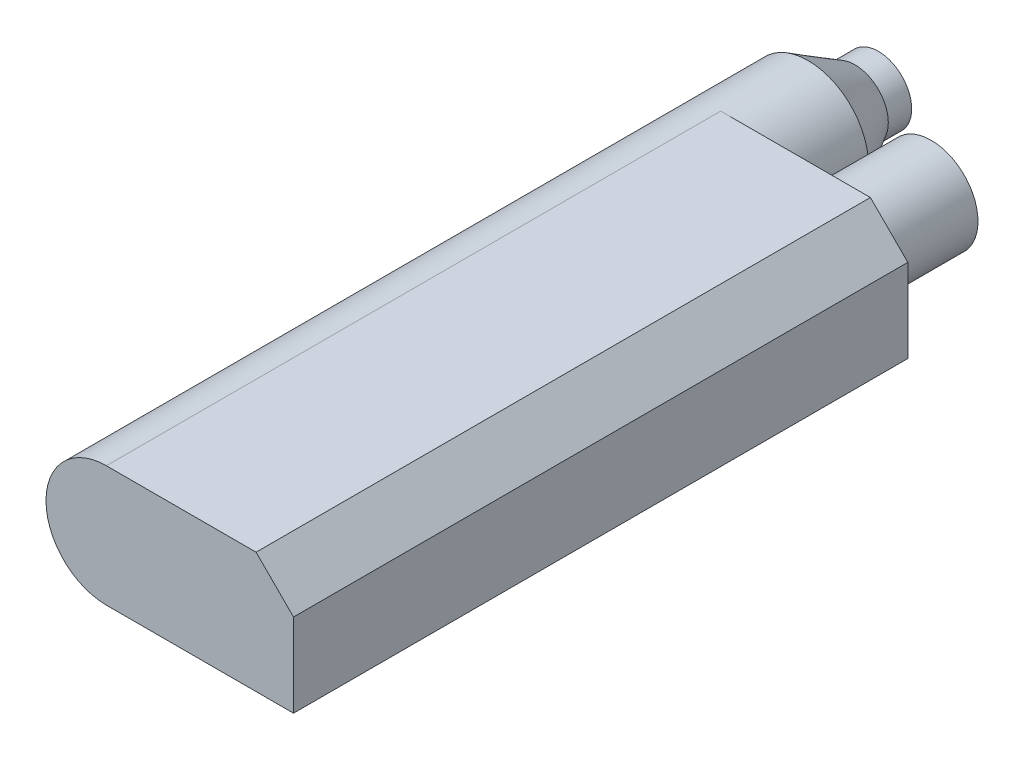
ISO-10303-21;
HEADER;
FILE_DESCRIPTION(('STEP AP214'),'2;1');
FILE_NAME('part.step','',(''),(''),'','','');
FILE_SCHEMA(('AUTOMOTIVE_DESIGN { 1 0 10303 214 1 1 1 1 }'));
ENDSEC;
DATA;
#1=APPLICATION_CONTEXT('core data for automotive mechanical design processes');
#2=APPLICATION_PROTOCOL_DEFINITION('international standard','automotive_design',2000,#1);
#3=PRODUCT_CONTEXT('',#1,'mechanical');
#4=PRODUCT('Part','Part','',(#3));
#5=PRODUCT_RELATED_PRODUCT_CATEGORY('part','',(#4));
#6=PRODUCT_DEFINITION_FORMATION('','',#4);
#7=PRODUCT_DEFINITION_CONTEXT('part definition',#1,'design');
#8=PRODUCT_DEFINITION('design','',#6,#7);
#9=PRODUCT_DEFINITION_SHAPE('','',#8);
#10=(LENGTH_UNIT() NAMED_UNIT(*) SI_UNIT(.MILLI.,.METRE.));
#11=(NAMED_UNIT(*) PLANE_ANGLE_UNIT() SI_UNIT($,.RADIAN.));
#12=(NAMED_UNIT(*) SI_UNIT($,.STERADIAN.) SOLID_ANGLE_UNIT());
#13=UNCERTAINTY_MEASURE_WITH_UNIT(LENGTH_MEASURE(1.E-05),#10,'distance_accuracy_value','');
#14=(GEOMETRIC_REPRESENTATION_CONTEXT(3) GLOBAL_UNCERTAINTY_ASSIGNED_CONTEXT((#13)) GLOBAL_UNIT_ASSIGNED_CONTEXT((#10,
#11,#12)) REPRESENTATION_CONTEXT('',''));
#15=CARTESIAN_POINT('',(0.,0.,0.));
#16=DIRECTION('',(0.,0.,1.));
#17=DIRECTION('',(1.,0.,0.));
#18=AXIS2_PLACEMENT_3D('',#15,#16,#17);
#19=CARTESIAN_POINT('',(0.,0.,500.));
#20=DIRECTION('',(0.,0.,-1.));
#21=DIRECTION('',(-1.,0.,0.));
#22=AXIS2_PLACEMENT_3D('',#19,#20,#21);
#23=CYLINDRICAL_SURFACE('',#22,713.105);
#24=CARTESIAN_POINT('',(0.,0.,500.));
#25=DIRECTION('',(0.,0.,1.));
#26=DIRECTION('',(1.,0.,0.));
#27=AXIS2_PLACEMENT_3D('',#24,#25,#26);
#28=CIRCLE('',#27,713.105);
#29=CARTESIAN_POINT('',(713.105,0.,500.));
#30=VERTEX_POINT('',#29);
#31=EDGE_CURVE('E129',#30,#30,#28,.T.);
#32=ORIENTED_EDGE('',*,*,#31,.F.);
#33=EDGE_LOOP('',(#32));
#34=FACE_BOUND('',#33,.T.);
#35=CARTESIAN_POINT('',(0.,0.,0.));
#36=DIRECTION('',(0.,0.,1.));
#37=DIRECTION('',(1.,0.,0.));
#38=AXIS2_PLACEMENT_3D('',#35,#36,#37);
#39=CIRCLE('',#38,713.105);
#40=CARTESIAN_POINT('',(713.105,0.,0.));
#41=VERTEX_POINT('',#40);
#42=EDGE_CURVE('E128',#41,#41,#39,.T.);
#43=ORIENTED_EDGE('',*,*,#42,.T.);
#44=EDGE_LOOP('',(#43));
#45=FACE_BOUND('',#44,.T.);
#46=ADVANCED_FACE('F41',(#34,#45),#23,.T.);
#47=CARTESIAN_POINT('',(0.,0.,0.));
#48=DIRECTION('',(0.,0.,1.));
#49=DIRECTION('',(1.,0.,0.));
#50=AXIS2_PLACEMENT_3D('',#47,#48,#49);
#51=PLANE('',#50);
#52=ORIENTED_EDGE('',*,*,#42,.F.);
#53=EDGE_LOOP('',(#52));
#54=FACE_BOUND('',#53,.T.);
#55=ADVANCED_FACE('F161',(#54),#51,.F.);
#56=CARTESIAN_POINT('',(0.,0.,500.));
#57=DIRECTION('',(0.,0.,1.));
#58=DIRECTION('',(1.,0.,0.));
#59=AXIS2_PLACEMENT_3D('',#56,#57,#58);
#60=CONICAL_SURFACE('',#59,713.105,0.5235987755983);
#61=CARTESIAN_POINT('',(0.,0.,1500.));
#62=DIRECTION('',(0.,0.,1.));
#63=DIRECTION('',(1.,0.,0.));
#64=AXIS2_PLACEMENT_3D('',#61,#62,#63);
#65=CIRCLE('',#64,1290.45526918963);
#66=CARTESIAN_POINT('',(1290.45526918963,0.,1500.));
#67=VERTEX_POINT('',#66);
#68=EDGE_CURVE('E125',#67,#67,#65,.T.);
#69=ORIENTED_EDGE('',*,*,#68,.F.);
#70=EDGE_LOOP('',(#69));
#71=FACE_BOUND('',#70,.T.);
#72=ORIENTED_EDGE('',*,*,#31,.T.);
#73=EDGE_LOOP('',(#72));
#74=FACE_BOUND('',#73,.T.);
#75=ADVANCED_FACE('F166',(#71,#74),#60,.T.);
#76=CARTESIAN_POINT('',(0.,0.,16500.));
#77=DIRECTION('',(0.,0.,-1.));
#78=DIRECTION('',(-1.,0.,0.));
#79=AXIS2_PLACEMENT_3D('',#76,#77,#78);
#80=CYLINDRICAL_SURFACE('',#79,1290.45526918963);
#81=CARTESIAN_POINT('',(0.,0.,16500.));
#82=DIRECTION('',(0.,0.,1.));
#83=DIRECTION('',(1.,0.,0.));
#84=AXIS2_PLACEMENT_3D('',#81,#82,#83);
#85=CIRCLE('',#84,1290.45526918963);
#86=CARTESIAN_POINT('',(0.,1290.45526918963,16500.));
#87=VERTEX_POINT('',#86);
#88=CARTESIAN_POINT('',(0.,-1290.45526918963,16500.));
#89=VERTEX_POINT('',#88);
#90=EDGE_CURVE('E101',#87,#89,#85,.T.);
#91=ORIENTED_EDGE('',*,*,#90,.F.);
#92=DIRECTION('',(0.,0.,1.));
#93=VECTOR('',#92,1.);
#94=CARTESIAN_POINT('',(0.,1290.45526918963,16500.));
#95=LINE('',#94,#93);
#96=CARTESIAN_POINT('',(0.,1290.45526918963,3369.71253889435));
#97=VERTEX_POINT('',#96);
#98=EDGE_CURVE('E116',#97,#87,#95,.T.);
#99=ORIENTED_EDGE('',*,*,#98,.F.);
#100=CARTESIAN_POINT('',(0.,0.,3369.71253889435));
#101=DIRECTION('',(0.,0.,1.));
#102=DIRECTION('',(1.,0.,0.));
#103=AXIS2_PLACEMENT_3D('',#100,#101,#102);
#104=CIRCLE('',#103,1290.45526918963);
#105=CARTESIAN_POINT('',(0.,-1290.45526918963,3369.71253889435));
#106=VERTEX_POINT('',#105);
#107=EDGE_CURVE('E132',#106,#97,#104,.T.);
#108=ORIENTED_EDGE('',*,*,#107,.F.);
#109=DIRECTION('',(0.,0.,-1.));
#110=VECTOR('',#109,1.);
#111=CARTESIAN_POINT('',(0.,-1290.45526918963,16500.));
#112=LINE('',#111,#110);
#113=EDGE_CURVE('E95',#89,#106,#112,.T.);
#114=ORIENTED_EDGE('',*,*,#113,.F.);
#115=EDGE_LOOP('',(#91,#99,#108,#114));
#116=FACE_BOUND('',#115,.T.);
#117=ORIENTED_EDGE('',*,*,#68,.T.);
#118=EDGE_LOOP('',(#117));
#119=FACE_BOUND('',#118,.T.);
#120=ADVANCED_FACE('F174',(#116,#119),#80,.T.);
#121=CARTESIAN_POINT('',(0.,0.,16500.));
#122=DIRECTION('',(0.,0.,1.));
#123=DIRECTION('',(1.,0.,0.));
#124=AXIS2_PLACEMENT_3D('',#121,#122,#123);
#125=PLANE('',#124);
#126=DIRECTION('',(0.,-1.,0.));
#127=VECTOR('',#126,1.);
#128=CARTESIAN_POINT('',(4000.,1290.45526918963,16500.));
#129=LINE('',#128,#127);
#130=CARTESIAN_POINT('',(4000.,490.455269189628,16500.));
#131=VERTEX_POINT('',#130);
#132=CARTESIAN_POINT('',(4000.,-1290.45526918963,16500.));
#133=VERTEX_POINT('',#132);
#134=EDGE_CURVE('E86',#131,#133,#129,.T.);
#135=ORIENTED_EDGE('',*,*,#134,.F.);
#136=DIRECTION('',(0.707106781186549,-0.707106781186546,0.));
#137=VECTOR('',#136,1.);
#138=CARTESIAN_POINT('',(2245.22763459481,2245.22763459482,16500.));
#139=LINE('',#138,#137);
#140=CARTESIAN_POINT('',(3200.,1290.45526918963,16500.));
#141=VERTEX_POINT('',#140);
#142=EDGE_CURVE('E64',#131,#141,#139,.F.);
#143=ORIENTED_EDGE('',*,*,#142,.T.);
#144=DIRECTION('',(-1.,0.,0.));
#145=VECTOR('',#144,1.);
#146=CARTESIAN_POINT('',(4000.,1290.45526918963,16500.));
#147=LINE('',#146,#145);
#148=EDGE_CURVE('E104',#141,#87,#147,.T.);
#149=ORIENTED_EDGE('',*,*,#148,.T.);
#150=ORIENTED_EDGE('',*,*,#90,.T.);
#151=DIRECTION('',(-1.,0.,0.));
#152=VECTOR('',#151,1.);
#153=CARTESIAN_POINT('',(4000.,-1290.45526918963,16500.));
#154=LINE('',#153,#152);
#155=EDGE_CURVE('E98',#133,#89,#154,.T.);
#156=ORIENTED_EDGE('',*,*,#155,.F.);
#157=EDGE_LOOP('',(#135,#143,#149,#150,#156));
#158=FACE_BOUND('',#157,.T.);
#159=ADVANCED_FACE('F99',(#158),#125,.T.);
#160=CARTESIAN_POINT('',(4000.,1290.45526918963,16500.));
#161=DIRECTION('',(0.,-1.,0.));
#162=DIRECTION('',(0.,0.,-1.));
#163=AXIS2_PLACEMENT_3D('',#160,#161,#162);
#164=PLANE('',#163);
#165=ORIENTED_EDGE('',*,*,#148,.F.);
#166=DIRECTION('',(0.,0.,-1.));
#167=VECTOR('',#166,1.);
#168=CARTESIAN_POINT('',(3200.,1290.45526918963,16500.));
#169=LINE('',#168,#167);
#170=CARTESIAN_POINT('',(3200.,1290.45526918963,3369.71253889435));
#171=VERTEX_POINT('',#170);
#172=EDGE_CURVE('E50',#141,#171,#169,.T.);
#173=ORIENTED_EDGE('',*,*,#172,.T.);
#174=DIRECTION('',(-1.,0.,0.));
#175=VECTOR('',#174,1.);
#176=CARTESIAN_POINT('',(4000.,1290.45526918963,3369.71253889435));
#177=LINE('',#176,#175);
#178=EDGE_CURVE('E112',#171,#97,#177,.T.);
#179=ORIENTED_EDGE('',*,*,#178,.T.);
#180=ORIENTED_EDGE('',*,*,#98,.T.);
#181=EDGE_LOOP('',(#165,#173,#179,#180));
#182=FACE_BOUND('',#181,.T.);
#183=ADVANCED_FACE('F181',(#182),#164,.F.);
#184=CARTESIAN_POINT('',(4000.,-1290.45526918963,16500.));
#185=DIRECTION('',(0.,1.,0.));
#186=DIRECTION('',(0.,0.,1.));
#187=AXIS2_PLACEMENT_3D('',#184,#185,#186);
#188=PLANE('',#187);
#189=ORIENTED_EDGE('',*,*,#113,.T.);
#190=DIRECTION('',(-1.,0.,0.));
#191=VECTOR('',#190,1.);
#192=CARTESIAN_POINT('',(4000.,-1290.45526918963,3369.71253889435));
#193=LINE('',#192,#191);
#194=CARTESIAN_POINT('',(4000.,-1290.45526918963,3369.71253889435));
#195=VERTEX_POINT('',#194);
#196=EDGE_CURVE('E105',#195,#106,#193,.T.);
#197=ORIENTED_EDGE('',*,*,#196,.F.);
#198=DIRECTION('',(0.,0.,-1.));
#199=VECTOR('',#198,1.);
#200=CARTESIAN_POINT('',(4000.,-1290.45526918963,16500.));
#201=LINE('',#200,#199);
#202=EDGE_CURVE('E91',#133,#195,#201,.T.);
#203=ORIENTED_EDGE('',*,*,#202,.F.);
#204=ORIENTED_EDGE('',*,*,#155,.T.);
#205=EDGE_LOOP('',(#189,#197,#203,#204));
#206=FACE_BOUND('',#205,.T.);
#207=ADVANCED_FACE('F107',(#206),#188,.F.);
#208=CARTESIAN_POINT('',(4000.,1290.45526918963,3369.71253889435));
#209=DIRECTION('',(0.,0.,1.));
#210=DIRECTION('',(1.,0.,0.));
#211=AXIS2_PLACEMENT_3D('',#208,#209,#210);
#212=PLANE('',#211);
#213=CARTESIAN_POINT('',(2500.,0.,3369.71253889435));
#214=DIRECTION('',(0.,0.,1.));
#215=DIRECTION('',(1.,0.,0.));
#216=AXIS2_PLACEMENT_3D('',#213,#214,#215);
#217=CIRCLE('',#216,1000.);
#218=CARTESIAN_POINT('',(3500.,0.,3369.71253889435));
#219=VERTEX_POINT('',#218);
#220=EDGE_CURVE('E137',#219,#219,#217,.F.);
#221=ORIENTED_EDGE('',*,*,#220,.F.);
#222=EDGE_LOOP('',(#221));
#223=FACE_BOUND('',#222,.T.);
#224=ORIENTED_EDGE('',*,*,#178,.F.);
#225=DIRECTION('',(-0.707106781186549,0.707106781186546,0.));
#226=VECTOR('',#225,1.);
#227=CARTESIAN_POINT('',(4000.,490.455269189628,3369.71253889435));
#228=LINE('',#227,#226);
#229=CARTESIAN_POINT('',(4000.,490.455269189628,3369.71253889435));
#230=VERTEX_POINT('',#229);
#231=EDGE_CURVE('E11',#171,#230,#228,.F.);
#232=ORIENTED_EDGE('',*,*,#231,.T.);
#233=DIRECTION('',(0.,1.,0.));
#234=VECTOR('',#233,1.);
#235=CARTESIAN_POINT('',(4000.,1290.45526918963,3369.71253889435));
#236=LINE('',#235,#234);
#237=EDGE_CURVE('E110',#195,#230,#236,.T.);
#238=ORIENTED_EDGE('',*,*,#237,.F.);
#239=ORIENTED_EDGE('',*,*,#196,.T.);
#240=ORIENTED_EDGE('',*,*,#107,.T.);
#241=EDGE_LOOP('',(#224,#232,#238,#239,#240));
#242=FACE_BOUND('',#241,.T.);
#243=ADVANCED_FACE('F145',(#223,#242),#212,.F.);
#244=CARTESIAN_POINT('',(4000.,0.,0.));
#245=DIRECTION('',(-1.,0.,0.));
#246=DIRECTION('',(0.,0.,1.));
#247=AXIS2_PLACEMENT_3D('',#244,#245,#246);
#248=PLANE('',#247);
#249=ORIENTED_EDGE('',*,*,#237,.T.);
#250=DIRECTION('',(0.,0.,1.));
#251=VECTOR('',#250,1.);
#252=CARTESIAN_POINT('',(4000.,490.455269189628,0.));
#253=LINE('',#252,#251);
#254=EDGE_CURVE('E94',#230,#131,#253,.T.);
#255=ORIENTED_EDGE('',*,*,#254,.T.);
#256=ORIENTED_EDGE('',*,*,#134,.T.);
#257=ORIENTED_EDGE('',*,*,#202,.T.);
#258=EDGE_LOOP('',(#249,#255,#256,#257));
#259=FACE_BOUND('',#258,.T.);
#260=ADVANCED_FACE('F89',(#259),#248,.F.);
#261=CARTESIAN_POINT('',(2500.,0.,1369.71253889435));
#262=DIRECTION('',(0.,0.,1.));
#263=DIRECTION('',(1.,0.,0.));
#264=AXIS2_PLACEMENT_3D('',#261,#262,#263);
#265=CYLINDRICAL_SURFACE('',#264,1000.);
#266=CARTESIAN_POINT('',(2500.,0.,1369.71253889435));
#267=DIRECTION('',(0.,0.,-1.));
#268=DIRECTION('',(-1.,0.,0.));
#269=AXIS2_PLACEMENT_3D('',#266,#267,#268);
#270=CIRCLE('',#269,1000.);
#271=CARTESIAN_POINT('',(1500.,0.,1369.71253889435));
#272=VERTEX_POINT('',#271);
#273=EDGE_CURVE('E119',#272,#272,#270,.T.);
#274=ORIENTED_EDGE('',*,*,#273,.F.);
#275=EDGE_LOOP('',(#274));
#276=FACE_BOUND('',#275,.T.);
#277=ORIENTED_EDGE('',*,*,#220,.T.);
#278=EDGE_LOOP('',(#277));
#279=FACE_BOUND('',#278,.T.);
#280=ADVANCED_FACE('F143',(#276,#279),#265,.T.);
#281=CARTESIAN_POINT('',(2500.,0.,1369.71253889435));
#282=DIRECTION('',(0.,0.,-1.));
#283=DIRECTION('',(-1.,0.,0.));
#284=AXIS2_PLACEMENT_3D('',#281,#282,#283);
#285=PLANE('',#284);
#286=ORIENTED_EDGE('',*,*,#273,.T.);
#287=EDGE_LOOP('',(#286));
#288=FACE_BOUND('',#287,.T.);
#289=ADVANCED_FACE('F154',(#288),#285,.T.);
#290=CARTESIAN_POINT('',(4000.,490.455269189628,0.));
#291=DIRECTION('',(-0.707106781186546,-0.707106781186549,0.));
#292=DIRECTION('',(0.,0.,1.));
#293=AXIS2_PLACEMENT_3D('',#290,#291,#292);
#294=PLANE('',#293);
#295=ORIENTED_EDGE('',*,*,#231,.F.);
#296=ORIENTED_EDGE('',*,*,#172,.F.);
#297=ORIENTED_EDGE('',*,*,#142,.F.);
#298=ORIENTED_EDGE('',*,*,#254,.F.);
#299=EDGE_LOOP('',(#295,#296,#297,#298));
#300=FACE_BOUND('',#299,.T.);
#301=ADVANCED_FACE('F44',(#300),#294,.F.);
#302=CLOSED_SHELL('',(#46,#55,#75,#120,#159,#183,#207,#243,#260,#280,#289,#301));
#303=MANIFOLD_SOLID_BREP('B2',#302);
#304=ADVANCED_BREP_SHAPE_REPRESENTATION('',(#18,#303),#14);
#305=SHAPE_DEFINITION_REPRESENTATION(#9,#304);
ENDSEC;
END-ISO-10303-21;
